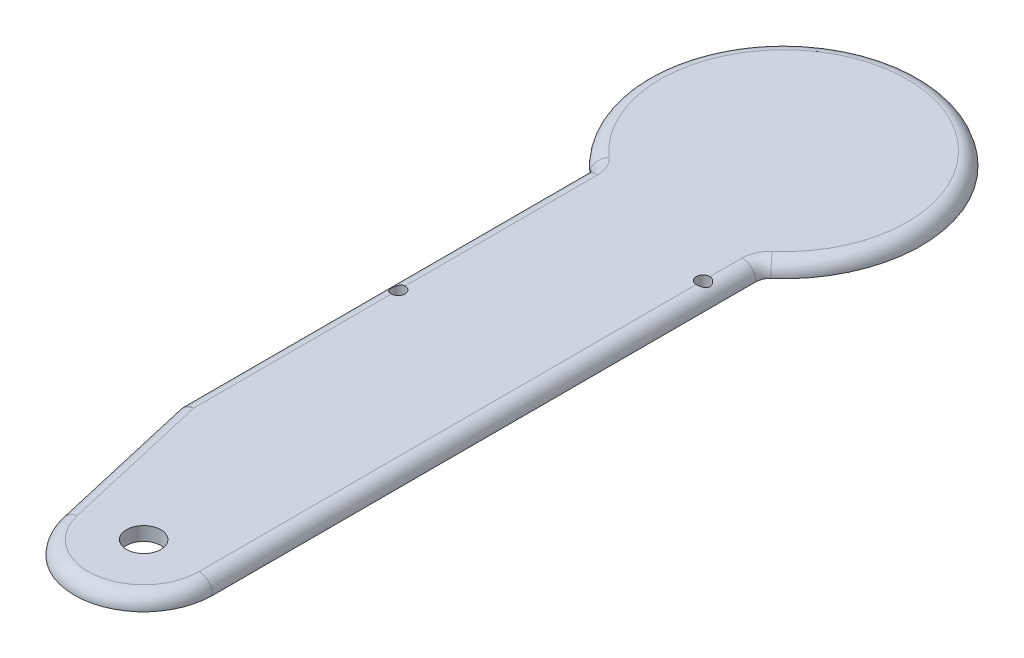
ISO-10303-21;
HEADER;
FILE_DESCRIPTION(('STEP AP214'),'2;1');
FILE_NAME('part.step','',(''),(''),'','','');
FILE_SCHEMA(('AUTOMOTIVE_DESIGN { 1 0 10303 214 1 1 1 1 }'));
ENDSEC;
DATA;
#1=APPLICATION_CONTEXT('core data for automotive mechanical design processes');
#2=APPLICATION_PROTOCOL_DEFINITION('international standard','automotive_design',2000,#1);
#3=PRODUCT_CONTEXT('',#1,'mechanical');
#4=PRODUCT('Part','Part','',(#3));
#5=PRODUCT_RELATED_PRODUCT_CATEGORY('part','',(#4));
#6=PRODUCT_DEFINITION_FORMATION('','',#4);
#7=PRODUCT_DEFINITION_CONTEXT('part definition',#1,'design');
#8=PRODUCT_DEFINITION('design','',#6,#7);
#9=PRODUCT_DEFINITION_SHAPE('','',#8);
#10=(LENGTH_UNIT() NAMED_UNIT(*) SI_UNIT(.MILLI.,.METRE.));
#11=(NAMED_UNIT(*) PLANE_ANGLE_UNIT() SI_UNIT($,.RADIAN.));
#12=(NAMED_UNIT(*) SI_UNIT($,.STERADIAN.) SOLID_ANGLE_UNIT());
#13=UNCERTAINTY_MEASURE_WITH_UNIT(LENGTH_MEASURE(1.E-05),#10,'distance_accuracy_value','');
#14=(GEOMETRIC_REPRESENTATION_CONTEXT(3) GLOBAL_UNCERTAINTY_ASSIGNED_CONTEXT((#13)) GLOBAL_UNIT_ASSIGNED_CONTEXT((#10,
#11,#12)) REPRESENTATION_CONTEXT('',''));
#15=CARTESIAN_POINT('',(0.,0.,0.));
#16=DIRECTION('',(0.,0.,1.));
#17=DIRECTION('',(1.,0.,0.));
#18=AXIS2_PLACEMENT_3D('',#15,#16,#17);
#19=CARTESIAN_POINT('',(0.,2.54,0.));
#20=DIRECTION('',(0.,1.,0.));
#21=DIRECTION('',(0.,0.,1.));
#22=AXIS2_PLACEMENT_3D('',#19,#20,#21);
#23=PLANE('',#22);
#24=CARTESIAN_POINT('',(3.09317439494254,2.54,121.427868644915));
#25=DIRECTION('',(0.,1.,0.));
#26=DIRECTION('',(0.,0.,1.));
#27=AXIS2_PLACEMENT_3D('',#24,#25,#26);
#28=CIRCLE('',#27,3.175);
#29=CARTESIAN_POINT('',(3.09317439494254,2.54,124.602868644915));
#30=VERTEX_POINT('',#29);
#31=EDGE_CURVE('E256',#30,#30,#28,.T.);
#32=ORIENTED_EDGE('',*,*,#31,.F.);
#33=EDGE_LOOP('',(#32));
#34=FACE_BOUND('',#33,.T.);
#35=CARTESIAN_POINT('',(13.335,2.54,28.2505998603972));
#36=DIRECTION('',(0.,1.,0.));
#37=DIRECTION('',(0.,0.,1.));
#38=AXIS2_PLACEMENT_3D('',#35,#36,#37);
#39=CIRCLE('',#38,1.27);
#40=CARTESIAN_POINT('',(13.335,2.54,26.9805998603972));
#41=VERTEX_POINT('',#40);
#42=CARTESIAN_POINT('',(13.335,2.54,29.5205998603972));
#43=VERTEX_POINT('',#42);
#44=EDGE_CURVE('E262',#41,#43,#39,.T.);
#45=ORIENTED_EDGE('',*,*,#44,.F.);
#46=DIRECTION('',(0.,0.,-1.));
#47=VECTOR('',#46,1.);
#48=CARTESIAN_POINT('',(13.335,2.54,21.0126479768734));
#49=LINE('',#48,#47);
#50=CARTESIAN_POINT('',(13.335,2.54,21.0126479768734));
#51=VERTEX_POINT('',#50);
#52=EDGE_CURVE('E66',#41,#51,#49,.T.);
#53=ORIENTED_EDGE('',*,*,#52,.T.);
#54=CARTESIAN_POINT('',(18.415,2.54,21.0126479768734));
#55=DIRECTION('',(0.,1.,0.));
#56=DIRECTION('',(0.,0.,1.));
#57=AXIS2_PLACEMENT_3D('',#54,#55,#56);
#58=CIRCLE('',#57,5.08);
#59=CARTESIAN_POINT('',(15.0668181818182,2.54,17.1921665265327));
#60=VERTEX_POINT('',#59);
#61=EDGE_CURVE('E71',#51,#60,#58,.F.);
#62=ORIENTED_EDGE('',*,*,#61,.T.);
#63=CARTESIAN_POINT('',(0.,2.54,0.));
#64=DIRECTION('',(0.,1.,0.));
#65=DIRECTION('',(0.,0.,1.));
#66=AXIS2_PLACEMENT_3D('',#63,#64,#65);
#67=CIRCLE('',#66,22.86);
#68=CARTESIAN_POINT('',(-15.0668181818182,2.54,17.1921665265328));
#69=VERTEX_POINT('',#68);
#70=EDGE_CURVE('E188',#60,#69,#67,.T.);
#71=ORIENTED_EDGE('',*,*,#70,.T.);
#72=CARTESIAN_POINT('',(-18.415,2.54,21.0126479768734));
#73=DIRECTION('',(0.,1.,0.));
#74=DIRECTION('',(0.,0.,1.));
#75=AXIS2_PLACEMENT_3D('',#72,#73,#74);
#76=CIRCLE('',#75,5.08);
#77=CARTESIAN_POINT('',(-13.335,2.54,21.0126479768734));
#78=VERTEX_POINT('',#77);
#79=EDGE_CURVE('E184',#69,#78,#76,.F.);
#80=ORIENTED_EDGE('',*,*,#79,.T.);
#81=DIRECTION('',(0.,0.,1.));
#82=VECTOR('',#81,1.);
#83=CARTESIAN_POINT('',(-13.335,2.54,95.7390735065831));
#84=LINE('',#83,#82);
#85=CARTESIAN_POINT('',(-13.335,2.54,56.6578686449149));
#86=VERTEX_POINT('',#85);
#87=EDGE_CURVE('E181',#78,#86,#84,.T.);
#88=ORIENTED_EDGE('',*,*,#87,.T.);
#89=CARTESIAN_POINT('',(-13.335,2.54,57.9278686449149));
#90=DIRECTION('',(0.,1.,0.));
#91=DIRECTION('',(0.,0.,1.));
#92=AXIS2_PLACEMENT_3D('',#89,#90,#91);
#93=CIRCLE('',#92,1.27);
#94=CARTESIAN_POINT('',(-13.335,2.54,59.1978686449149));
#95=VERTEX_POINT('',#94);
#96=EDGE_CURVE('E273',#95,#86,#93,.T.);
#97=ORIENTED_EDGE('',*,*,#96,.F.);
#98=DIRECTION('',(0.,0.,1.));
#99=VECTOR('',#98,1.);
#100=CARTESIAN_POINT('',(-13.335,2.54,95.7390735065831));
#101=LINE('',#100,#99);
#102=CARTESIAN_POINT('',(-13.335,2.54,95.7390735065831));
#103=VERTEX_POINT('',#102);
#104=EDGE_CURVE('E170',#95,#103,#101,.T.);
#105=ORIENTED_EDGE('',*,*,#104,.T.);
#106=DIRECTION('',(0.224495594777402,0.,0.974475103799754));
#107=VECTOR('',#106,1.);
#108=CARTESIAN_POINT('',(-6.88722967464479,2.54,123.727113375729));
#109=LINE('',#108,#107);
#110=CARTESIAN_POINT('',(-6.8872296746448,2.54,123.727113375729));
#111=VERTEX_POINT('',#110);
#112=EDGE_CURVE('E173',#103,#111,#109,.T.);
#113=ORIENTED_EDGE('',*,*,#112,.T.);
#114=CARTESIAN_POINT('',(3.09317439494254,2.54,121.427868644915));
#115=DIRECTION('',(0.,1.,0.));
#116=DIRECTION('',(0.,0.,1.));
#117=AXIS2_PLACEMENT_3D('',#114,#115,#116);
#118=CIRCLE('',#117,10.2418256050575);
#119=CARTESIAN_POINT('',(13.335,2.54,121.427868644915));
#120=VERTEX_POINT('',#119);
#121=EDGE_CURVE('E140',#111,#120,#118,.T.);
#122=ORIENTED_EDGE('',*,*,#121,.T.);
#123=DIRECTION('',(0.,0.,-1.));
#124=VECTOR('',#123,1.);
#125=CARTESIAN_POINT('',(13.335,2.54,21.0126479768734));
#126=LINE('',#125,#124);
#127=EDGE_CURVE('E178',#120,#43,#126,.T.);
#128=ORIENTED_EDGE('',*,*,#127,.T.);
#129=EDGE_LOOP('',(#45,#53,#62,#71,#80,#88,#97,#105,#113,#122,#128));
#130=FACE_BOUND('',#129,.T.);
#131=ADVANCED_FACE('F48',(#34,#130),#23,.T.);
#132=CARTESIAN_POINT('',(0.,0.,0.));
#133=DIRECTION('',(0.,1.,0.));
#134=DIRECTION('',(0.,0.,1.));
#135=AXIS2_PLACEMENT_3D('',#132,#133,#134);
#136=PLANE('',#135);
#137=DIRECTION('',(0.224495594777402,0.,0.974475103799754));
#138=VECTOR('',#137,1.);
#139=CARTESIAN_POINT('',(-15.875,0.,96.0278686449149));
#140=LINE('',#139,#138);
#141=CARTESIAN_POINT('',(-15.8101667636514,0.,96.3092923173177));
#142=VERTEX_POINT('',#141);
#143=CARTESIAN_POINT('',(-9.36239643829617,0.,124.297332186463));
#144=VERTEX_POINT('',#143);
#145=EDGE_CURVE('E128',#142,#144,#140,.T.);
#146=ORIENTED_EDGE('',*,*,#145,.F.);
#147=CARTESIAN_POINT('',(-13.335,0.,95.7390735065831));
#148=DIRECTION('',(0.,1.,0.));
#149=DIRECTION('',(0.,0.,1.));
#150=AXIS2_PLACEMENT_3D('',#147,#148,#149);
#151=CIRCLE('',#150,2.54);
#152=CARTESIAN_POINT('',(-15.875,0.,95.7390735065831));
#153=VERTEX_POINT('',#152);
#154=EDGE_CURVE('E160',#142,#153,#151,.F.);
#155=ORIENTED_EDGE('',*,*,#154,.T.);
#156=DIRECTION('',(0.,0.,1.));
#157=VECTOR('',#156,1.);
#158=CARTESIAN_POINT('',(-15.875,0.,19.8278686449149));
#159=LINE('',#158,#157);
#160=CARTESIAN_POINT('',(-15.875,0.,21.0126479768734));
#161=VERTEX_POINT('',#160);
#162=EDGE_CURVE('E150',#161,#153,#159,.T.);
#163=ORIENTED_EDGE('',*,*,#162,.F.);
#164=CARTESIAN_POINT('',(-18.415,0.,21.0126479768734));
#165=DIRECTION('',(0.,1.,0.));
#166=DIRECTION('',(0.,0.,1.));
#167=AXIS2_PLACEMENT_3D('',#164,#165,#166);
#168=CIRCLE('',#167,2.54);
#169=CARTESIAN_POINT('',(-16.7409090909091,0.,19.1024072517031));
#170=VERTEX_POINT('',#169);
#171=EDGE_CURVE('E163',#161,#170,#168,.T.);
#172=ORIENTED_EDGE('',*,*,#171,.T.);
#173=CARTESIAN_POINT('',(0.,0.,0.));
#174=DIRECTION('',(0.,1.,0.));
#175=DIRECTION('',(0.,0.,1.));
#176=AXIS2_PLACEMENT_3D('',#173,#174,#175);
#177=CIRCLE('',#176,25.4);
#178=CARTESIAN_POINT('',(16.7409090909091,0.,19.1024072517031));
#179=VERTEX_POINT('',#178);
#180=EDGE_CURVE('E154',#179,#170,#177,.T.);
#181=ORIENTED_EDGE('',*,*,#180,.F.);
#182=CARTESIAN_POINT('',(18.415,0.,21.0126479768734));
#183=DIRECTION('',(0.,1.,0.));
#184=DIRECTION('',(0.,0.,1.));
#185=AXIS2_PLACEMENT_3D('',#182,#183,#184);
#186=CIRCLE('',#185,2.54);
#187=CARTESIAN_POINT('',(15.875,0.,21.0126479768734));
#188=VERTEX_POINT('',#187);
#189=EDGE_CURVE('E167',#179,#188,#186,.T.);
#190=ORIENTED_EDGE('',*,*,#189,.T.);
#191=DIRECTION('',(0.,0.,-1.));
#192=VECTOR('',#191,1.);
#193=CARTESIAN_POINT('',(15.875,0.,96.0278686449149));
#194=LINE('',#193,#192);
#195=CARTESIAN_POINT('',(15.875,0.,121.427868644915));
#196=VERTEX_POINT('',#195);
#197=EDGE_CURVE('E131',#196,#188,#194,.T.);
#198=ORIENTED_EDGE('',*,*,#197,.F.);
#199=CARTESIAN_POINT('',(3.09317439494254,0.,121.427868644915));
#200=DIRECTION('',(0.,1.,0.));
#201=DIRECTION('',(0.,0.,1.));
#202=AXIS2_PLACEMENT_3D('',#199,#200,#201);
#203=CIRCLE('',#202,12.7818256050575);
#204=EDGE_CURVE('E123',#144,#196,#203,.T.);
#205=ORIENTED_EDGE('',*,*,#204,.F.);
#206=EDGE_LOOP('',(#146,#155,#163,#172,#181,#190,#198,#205));
#207=FACE_BOUND('',#206,.T.);
#208=CARTESIAN_POINT('',(-13.335,0.,57.9278686449149));
#209=DIRECTION('',(0.,1.,0.));
#210=DIRECTION('',(0.,0.,1.));
#211=AXIS2_PLACEMENT_3D('',#208,#209,#210);
#212=CIRCLE('',#211,1.27);
#213=CARTESIAN_POINT('',(-13.335,0.,59.1978686449149));
#214=VERTEX_POINT('',#213);
#215=EDGE_CURVE('E266',#214,#214,#212,.T.);
#216=ORIENTED_EDGE('',*,*,#215,.T.);
#217=EDGE_LOOP('',(#216));
#218=FACE_BOUND('',#217,.T.);
#219=CARTESIAN_POINT('',(3.09317439494254,0.,121.427868644915));
#220=DIRECTION('',(0.,1.,0.));
#221=DIRECTION('',(0.,0.,1.));
#222=AXIS2_PLACEMENT_3D('',#219,#220,#221);
#223=CIRCLE('',#222,3.175);
#224=CARTESIAN_POINT('',(3.09317439494254,0.,124.602868644915));
#225=VERTEX_POINT('',#224);
#226=EDGE_CURVE('E259',#225,#225,#223,.T.);
#227=ORIENTED_EDGE('',*,*,#226,.T.);
#228=EDGE_LOOP('',(#227));
#229=FACE_BOUND('',#228,.T.);
#230=CARTESIAN_POINT('',(13.335,0.,28.2505998603972));
#231=DIRECTION('',(0.,1.,0.));
#232=DIRECTION('',(0.,0.,1.));
#233=AXIS2_PLACEMENT_3D('',#230,#231,#232);
#234=CIRCLE('',#233,1.27);
#235=CARTESIAN_POINT('',(13.335,0.,29.5205998603972));
#236=VERTEX_POINT('',#235);
#237=EDGE_CURVE('E269',#236,#236,#234,.T.);
#238=ORIENTED_EDGE('',*,*,#237,.T.);
#239=EDGE_LOOP('',(#238));
#240=FACE_BOUND('',#239,.T.);
#241=ADVANCED_FACE('F125',(#207,#218,#229,#240),#136,.F.);
#242=CARTESIAN_POINT('',(-13.335,2.54,57.9278686449149));
#243=DIRECTION('',(0.,-1.,0.));
#244=DIRECTION('',(0.,0.,-1.));
#245=AXIS2_PLACEMENT_3D('',#242,#243,#244);
#246=CYLINDRICAL_SURFACE('',#245,1.27);
#247=ORIENTED_EDGE('',*,*,#96,.T.);
#248=CARTESIAN_POINT('',(-13.335,2.54,56.6578686449149));
#249=CARTESIAN_POINT('',(-13.3685345942167,2.54000342832328,56.6578668634472));
#250=CARTESIAN_POINT('',(-13.4020513618429,2.53933515140333,56.659197786609));
#251=CARTESIAN_POINT('',(-13.468811013313,2.53669226267304,56.6644940244821));
#252=CARTESIAN_POINT('',(-13.5020540017188,2.5347181754675,56.6684582812633));
#253=CARTESIAN_POINT('',(-13.6007001890822,2.5269200467094,56.6841994487184));
#254=CARTESIAN_POINT('',(-13.6653865691835,2.51921930895587,56.6998255446011));
#255=CARTESIAN_POINT('',(-13.7908255180717,2.49957243089578,56.7406538840443));
#256=CARTESIAN_POINT('',(-13.8515824932679,2.48763114703347,56.7658451754331));
#257=CARTESIAN_POINT('',(-13.9679961690622,2.46058761540837,56.8249265719279));
#258=CARTESIAN_POINT('',(-14.0236476966289,2.44548221141404,56.8588253705301));
#259=CARTESIAN_POINT('',(-14.1319389724485,2.41244361519352,56.9366576743732));
#260=CARTESIAN_POINT('',(-14.1841978627295,2.39439515549001,56.9810711066731));
#261=CARTESIAN_POINT('',(-14.2808742053925,2.35787969829176,57.0776363350059));
#262=CARTESIAN_POINT('',(-14.3252865037335,2.33941243462373,57.1297931762225));
#263=CARTESIAN_POINT('',(-14.4084706424894,2.30249645476485,57.2452232115186));
#264=CARTESIAN_POINT('',(-14.4465371088236,2.28416043722765,57.3090450150755));
#265=CARTESIAN_POINT('',(-14.5112342622057,2.25153158727119,57.443196842687));
#266=CARTESIAN_POINT('',(-14.5378733891325,2.23723577355424,57.5135220167264));
#267=CARTESIAN_POINT('',(-14.57722799061,2.21561503041513,57.6543925518967));
#268=CARTESIAN_POINT('',(-14.5906815353958,2.20792402232111,57.7246726984248));
#269=CARTESIAN_POINT('',(-14.6055422458466,2.19941002335184,57.8668801313889));
#270=CARTESIAN_POINT('',(-14.6069610435321,2.1985804007175,57.9388057599526));
#271=CARTESIAN_POINT('',(-14.5982528116857,2.20358883939752,58.0730125775866));
#272=CARTESIAN_POINT('',(-14.589486202326,2.20864140862576,58.1354185179297));
#273=CARTESIAN_POINT('',(-14.5630132221279,2.2234683165053,58.2577167700999));
#274=CARTESIAN_POINT('',(-14.5453041968256,2.23324405714403,58.3176083298381));
#275=CARTESIAN_POINT('',(-14.5011267389414,2.256630786266,58.434888821377));
#276=CARTESIAN_POINT('',(-14.4744639065128,2.27032579467092,58.4921869809792));
#277=CARTESIAN_POINT('',(-14.4132838643138,2.30001279493636,58.6017727560536));
#278=CARTESIAN_POINT('',(-14.3787629105045,2.3160058803827,58.6540579661513));
#279=CARTESIAN_POINT('',(-14.2977453521224,2.3509365238757,58.7591088988116));
#280=CARTESIAN_POINT('',(-14.2502854429472,2.3699903595553,58.8110955769709));
#281=CARTESIAN_POINT('',(-14.1472384712374,2.40725373504748,58.906700016829));
#282=CARTESIAN_POINT('',(-14.0916470490276,2.42546281500637,58.9503132599566));
#283=CARTESIAN_POINT('',(-13.9706267780721,2.46002401214475,59.0298496904732));
#284=CARTESIAN_POINT('',(-13.9048586712854,2.4762488597521,59.0653158685882));
#285=CARTESIAN_POINT('',(-13.7673106117041,2.50391748349066,59.1243573234846));
#286=CARTESIAN_POINT('',(-13.6955417405689,2.51536984868801,59.147953977915));
#287=CARTESIAN_POINT('',(-13.5751590407403,2.5290606333048,59.1758816110379));
#288=CARTESIAN_POINT('',(-13.5276232427572,2.53313545728544,59.1840986450059));
#289=CARTESIAN_POINT('',(-13.4317390252086,2.53861665841248,59.1951024340299));
#290=CARTESIAN_POINT('',(-13.3833899777024,2.54002086815003,59.1978847784668));
#291=CARTESIAN_POINT('',(-13.335,2.54,59.1978686449149));
#292=B_SPLINE_CURVE_WITH_KNOTS('',3,(#248,#249,#250,#251,#252,#253,#254,#255,#256,#257,#258,
#259,#260,#261,#262,#263,#264,#265,#266,#267,#268,#269,#270,#271,#272,#273,#274,#275,#276,#277,
#278,#279,#280,#281,#282,#283,#284,#285,#286,#287,#288,#289,#290,#291),.UNSPECIFIED.,.F.,.F.,(4,
2,2,2,2,2,2,2,2,2,2,2,2,2,2,2,2,2,2,2,2,4),(0.,0.100536257078659,0.201032148572755,
0.400941212724322,0.600622067407709,0.800503061810346,1.01237290775346,1.22438140734053,
1.45284573032248,1.68114102489041,1.89576940943866,2.11019032418494,2.29896967474706,
2.48780509548095,2.68103847063103,2.87436410615118,3.09219313103621,3.31013937500783,
3.53831494714631,3.76607807807347,3.91095596271824,4.05595137681726),.UNSPECIFIED.);
#293=EDGE_CURVE('E11',#86,#95,#292,.T.);
#294=ORIENTED_EDGE('',*,*,#293,.T.);
#295=EDGE_LOOP('',(#247,#294));
#296=FACE_BOUND('',#295,.T.);
#297=ORIENTED_EDGE('',*,*,#215,.F.);
#298=EDGE_LOOP('',(#297));
#299=FACE_BOUND('',#298,.T.);
#300=ADVANCED_FACE('F240',(#296,#299),#246,.F.);
#301=CARTESIAN_POINT('',(3.09317439494254,2.54,121.427868644915));
#302=DIRECTION('',(0.,-1.,0.));
#303=DIRECTION('',(0.,0.,-1.));
#304=AXIS2_PLACEMENT_3D('',#301,#302,#303);
#305=CYLINDRICAL_SURFACE('',#304,3.175);
#306=ORIENTED_EDGE('',*,*,#31,.T.);
#307=EDGE_LOOP('',(#306));
#308=FACE_BOUND('',#307,.T.);
#309=ORIENTED_EDGE('',*,*,#226,.F.);
#310=EDGE_LOOP('',(#309));
#311=FACE_BOUND('',#310,.T.);
#312=ADVANCED_FACE('F245',(#308,#311),#305,.F.);
#313=CARTESIAN_POINT('',(13.335,2.54,28.2505998603972));
#314=DIRECTION('',(0.,-1.,0.));
#315=DIRECTION('',(0.,0.,-1.));
#316=AXIS2_PLACEMENT_3D('',#313,#314,#315);
#317=CYLINDRICAL_SURFACE('',#316,1.27);
#318=ORIENTED_EDGE('',*,*,#44,.T.);
#319=CARTESIAN_POINT('',(13.335,2.54,29.5205998603972));
#320=CARTESIAN_POINT('',(13.3685345942167,2.54000342832328,29.520601641865));
#321=CARTESIAN_POINT('',(13.4020513618429,2.53933515140333,29.5192707187032));
#322=CARTESIAN_POINT('',(13.468811013313,2.53669226267304,29.5139744808301));
#323=CARTESIAN_POINT('',(13.5020540017188,2.5347181754675,29.5100102240488));
#324=CARTESIAN_POINT('',(13.6007001890822,2.5269200467094,29.4942690565938));
#325=CARTESIAN_POINT('',(13.6653865691835,2.51921930895587,29.4786429607111));
#326=CARTESIAN_POINT('',(13.7908255180717,2.49957243089578,29.4378146212678));
#327=CARTESIAN_POINT('',(13.8515824932679,2.48763114703347,29.412623329879));
#328=CARTESIAN_POINT('',(13.9679961690622,2.46058761540837,29.3535419333843));
#329=CARTESIAN_POINT('',(14.0236476966289,2.44548221141404,29.319643134782));
#330=CARTESIAN_POINT('',(14.1319389724485,2.41244361519351,29.241810830939));
#331=CARTESIAN_POINT('',(14.1841978627295,2.39439515549001,29.1973973986391));
#332=CARTESIAN_POINT('',(14.2808742053925,2.35787969829176,29.1008321703063));
#333=CARTESIAN_POINT('',(14.3252865037335,2.33941243462373,29.0486753290896));
#334=CARTESIAN_POINT('',(14.4084706424894,2.30249645476485,28.9332452937936));
#335=CARTESIAN_POINT('',(14.4465371088237,2.28416043722765,28.8694234902367));
#336=CARTESIAN_POINT('',(14.5112342622057,2.25153158727119,28.7352716626252));
#337=CARTESIAN_POINT('',(14.5378733891325,2.23723577355424,28.6649464885858));
#338=CARTESIAN_POINT('',(14.57722799061,2.21561503041512,28.5240759534155));
#339=CARTESIAN_POINT('',(14.5906815353958,2.2079240223211,28.4537958068874));
#340=CARTESIAN_POINT('',(14.6055422458466,2.19941002335184,28.3115883739233));
#341=CARTESIAN_POINT('',(14.6069610435321,2.1985804007175,28.2396627453596));
#342=CARTESIAN_POINT('',(14.5982528116857,2.20358883939751,28.1054559277256));
#343=CARTESIAN_POINT('',(14.589486202326,2.20864140862576,28.0430499873825));
#344=CARTESIAN_POINT('',(14.5630132221279,2.2234683165053,27.9207517352122));
#345=CARTESIAN_POINT('',(14.5453041968256,2.23324405714403,27.8608601754741));
#346=CARTESIAN_POINT('',(14.5011267389414,2.256630786266,27.7435796839352));
#347=CARTESIAN_POINT('',(14.4744639065128,2.27032579467091,27.686281524333));
#348=CARTESIAN_POINT('',(14.4132838643138,2.30001279493636,27.5766957492585));
#349=CARTESIAN_POINT('',(14.3787629105045,2.31600588038269,27.5244105391609));
#350=CARTESIAN_POINT('',(14.2977453521224,2.3509365238757,27.4193596065005));
#351=CARTESIAN_POINT('',(14.2502854429472,2.3699903595553,27.3673729283413));
#352=CARTESIAN_POINT('',(14.1472384712374,2.40725373504747,27.2717684884831));
#353=CARTESIAN_POINT('',(14.0916470490276,2.42546281500638,27.2281552453556));
#354=CARTESIAN_POINT('',(13.9706267780721,2.46002401214476,27.1486188148389));
#355=CARTESIAN_POINT('',(13.9048586712854,2.47624885975211,27.113152636724));
#356=CARTESIAN_POINT('',(13.7673106117041,2.50391748349066,27.0541111818275));
#357=CARTESIAN_POINT('',(13.6955417405689,2.51536984868801,27.0305145273972));
#358=CARTESIAN_POINT('',(13.5751590407403,2.5290606333048,27.0025868942743));
#359=CARTESIAN_POINT('',(13.5276232427572,2.53313545728544,26.9943698603063));
#360=CARTESIAN_POINT('',(13.4317390252086,2.53861665841248,26.9833660712823));
#361=CARTESIAN_POINT('',(13.3833899777024,2.54002086815003,26.9805837268453));
#362=CARTESIAN_POINT('',(13.335,2.54,26.9805998603972));
#363=B_SPLINE_CURVE_WITH_KNOTS('',3,(#319,#320,#321,#322,#323,#324,#325,#326,#327,#328,#329,
#330,#331,#332,#333,#334,#335,#336,#337,#338,#339,#340,#341,#342,#343,#344,#345,#346,#347,#348,
#349,#350,#351,#352,#353,#354,#355,#356,#357,#358,#359,#360,#361,#362),.UNSPECIFIED.,.F.,.F.,(4,
2,2,2,2,2,2,2,2,2,2,2,2,2,2,2,2,2,2,2,2,4),(0.,0.10053625707866,0.201032148572757,
0.400941212724324,0.600622067407714,0.800503061810349,1.01237290775346,1.22438140734053,
1.45284573032248,1.68114102489041,1.89576940943866,2.11019032418495,2.29896967474707,
2.48780509548096,2.68103847063104,2.87436410615118,3.09219313103622,3.31013937500784,
3.53831494714633,3.76607807807348,3.91095596271825,4.05595137681726),.UNSPECIFIED.);
#364=EDGE_CURVE('E58',#43,#41,#363,.T.);
#365=ORIENTED_EDGE('',*,*,#364,.T.);
#366=EDGE_LOOP('',(#318,#365));
#367=FACE_BOUND('',#366,.T.);
#368=ORIENTED_EDGE('',*,*,#237,.F.);
#369=EDGE_LOOP('',(#368));
#370=FACE_BOUND('',#369,.T.);
#371=ADVANCED_FACE('F208',(#367,#370),#317,.F.);
#372=CARTESIAN_POINT('',(3.09317439494254,0.,121.427868644915));
#373=DIRECTION('',(0.,1.,0.));
#374=DIRECTION('',(0.,0.,1.));
#375=AXIS2_PLACEMENT_3D('',#372,#373,#374);
#376=TOROIDAL_SURFACE('',#375,10.2418256050575,2.54);
#377=CARTESIAN_POINT('',(-6.8872296746448,0.,123.727113375729));
#378=DIRECTION('',(-0.224495594777402,0.,-0.974475103799753));
#379=DIRECTION('',(-0.974475103799754,0.,0.224495594777402));
#380=AXIS2_PLACEMENT_3D('',#377,#378,#379);
#381=CIRCLE('',#380,2.54);
#382=EDGE_CURVE('E139',#144,#111,#381,.T.);
#383=ORIENTED_EDGE('',*,*,#382,.F.);
#384=ORIENTED_EDGE('',*,*,#204,.T.);
#385=CARTESIAN_POINT('',(13.335,0.,121.427868644915));
#386=DIRECTION('',(0.,0.,-1.));
#387=DIRECTION('',(-1.,0.,0.));
#388=AXIS2_PLACEMENT_3D('',#385,#386,#387);
#389=CIRCLE('',#388,2.54);
#390=EDGE_CURVE('E52',#120,#196,#389,.T.);
#391=ORIENTED_EDGE('',*,*,#390,.F.);
#392=ORIENTED_EDGE('',*,*,#121,.F.);
#393=EDGE_LOOP('',(#383,#384,#391,#392));
#394=FACE_BOUND('',#393,.T.);
#395=ADVANCED_FACE('F50',(#394),#376,.T.);
#396=CARTESIAN_POINT('',(13.335,0.,0.));
#397=DIRECTION('',(0.,0.,1.));
#398=DIRECTION('',(1.,0.,0.));
#399=AXIS2_PLACEMENT_3D('',#396,#397,#398);
#400=CYLINDRICAL_SURFACE('',#399,2.54);
#401=ORIENTED_EDGE('',*,*,#390,.T.);
#402=ORIENTED_EDGE('',*,*,#197,.T.);
#403=CARTESIAN_POINT('',(13.335,0.,21.0126479768734));
#404=DIRECTION('',(0.,0.,-1.));
#405=DIRECTION('',(-1.,0.,0.));
#406=AXIS2_PLACEMENT_3D('',#403,#404,#405);
#407=CIRCLE('',#406,2.54);
#408=EDGE_CURVE('E144',#51,#188,#407,.T.);
#409=ORIENTED_EDGE('',*,*,#408,.F.);
#410=ORIENTED_EDGE('',*,*,#52,.F.);
#411=ORIENTED_EDGE('',*,*,#364,.F.);
#412=ORIENTED_EDGE('',*,*,#127,.F.);
#413=EDGE_LOOP('',(#401,#402,#409,#410,#411,#412));
#414=FACE_BOUND('',#413,.T.);
#415=ADVANCED_FACE('F211',(#414),#400,.T.);
#416=CARTESIAN_POINT('',(-33.6073326917641,0.,7.74232005733209));
#417=DIRECTION('',(-0.224495594777402,0.,-0.974475103799754));
#418=DIRECTION('',(-0.974475103799754,0.,0.224495594777402));
#419=AXIS2_PLACEMENT_3D('',#416,#417,#418);
#420=CYLINDRICAL_SURFACE('',#419,2.54);
#421=ORIENTED_EDGE('',*,*,#382,.T.);
#422=ORIENTED_EDGE('',*,*,#112,.F.);
#423=CARTESIAN_POINT('',(-13.335,0.,95.7390735065831));
#424=DIRECTION('',(-0.224495594777402,0.,-0.974475103799753));
#425=DIRECTION('',(-0.974475103799754,0.,0.224495594777402));
#426=AXIS2_PLACEMENT_3D('',#423,#424,#425);
#427=CIRCLE('',#426,2.54);
#428=EDGE_CURVE('E147',#142,#103,#427,.T.);
#429=ORIENTED_EDGE('',*,*,#428,.F.);
#430=ORIENTED_EDGE('',*,*,#145,.T.);
#431=EDGE_LOOP('',(#421,#422,#429,#430));
#432=FACE_BOUND('',#431,.T.);
#433=ADVANCED_FACE('F145',(#432),#420,.T.);
#434=CARTESIAN_POINT('',(18.415,0.,21.0126479768734));
#435=DIRECTION('',(0.,1.,0.));
#436=DIRECTION('',(0.,0.,1.));
#437=AXIS2_PLACEMENT_3D('',#434,#435,#436);
#438=TOROIDAL_SURFACE('',#437,5.08,2.54);
#439=ORIENTED_EDGE('',*,*,#408,.T.);
#440=ORIENTED_EDGE('',*,*,#189,.F.);
#441=CARTESIAN_POINT('',(15.0668181818182,0.,17.1921665265327));
#442=DIRECTION('',(0.752063277626104,0.,-0.659090909090909));
#443=DIRECTION('',(-0.659090909090909,0.,-0.752063277626105));
#444=AXIS2_PLACEMENT_3D('',#441,#442,#443);
#445=CIRCLE('',#444,2.54);
#446=EDGE_CURVE('E286',#60,#179,#445,.T.);
#447=ORIENTED_EDGE('',*,*,#446,.F.);
#448=ORIENTED_EDGE('',*,*,#61,.F.);
#449=EDGE_LOOP('',(#439,#440,#447,#448));
#450=FACE_BOUND('',#449,.T.);
#451=ADVANCED_FACE('F218',(#450),#438,.T.);
#452=CARTESIAN_POINT('',(-13.335,0.,95.7390735065831));
#453=DIRECTION('',(0.,1.,0.));
#454=DIRECTION('',(0.,0.,1.));
#455=AXIS2_PLACEMENT_3D('',#452,#453,#454);
#456=SPHERICAL_SURFACE('',#455,2.54);
#457=ORIENTED_EDGE('',*,*,#154,.F.);
#458=ORIENTED_EDGE('',*,*,#428,.T.);
#459=CARTESIAN_POINT('',(-13.335,0.,95.7390735065831));
#460=DIRECTION('',(0.,0.,-1.));
#461=DIRECTION('',(-1.,0.,0.));
#462=AXIS2_PLACEMENT_3D('',#459,#460,#461);
#463=CIRCLE('',#462,2.54);
#464=EDGE_CURVE('E296',#153,#103,#463,.T.);
#465=ORIENTED_EDGE('',*,*,#464,.F.);
#466=EDGE_LOOP('',(#457,#458,#465));
#467=FACE_BOUND('',#466,.T.);
#468=ADVANCED_FACE('F221',(#467),#456,.T.);
#469=CARTESIAN_POINT('',(0.,0.,0.));
#470=DIRECTION('',(0.,1.,0.));
#471=DIRECTION('',(0.,0.,1.));
#472=AXIS2_PLACEMENT_3D('',#469,#470,#471);
#473=TOROIDAL_SURFACE('',#472,22.86,2.54);
#474=ORIENTED_EDGE('',*,*,#446,.T.);
#475=ORIENTED_EDGE('',*,*,#180,.T.);
#476=CARTESIAN_POINT('',(-15.0668181818182,0.,17.1921665265328));
#477=DIRECTION('',(0.752063277626103,0.,0.659090909090911));
#478=DIRECTION('',(0.659090909090911,0.,-0.752063277626103));
#479=AXIS2_PLACEMENT_3D('',#476,#477,#478);
#480=CIRCLE('',#479,2.54);
#481=EDGE_CURVE('E284',#69,#170,#480,.T.);
#482=ORIENTED_EDGE('',*,*,#481,.F.);
#483=ORIENTED_EDGE('',*,*,#70,.F.);
#484=EDGE_LOOP('',(#474,#475,#482,#483));
#485=FACE_BOUND('',#484,.T.);
#486=ADVANCED_FACE('F225',(#485),#473,.T.);
#487=CARTESIAN_POINT('',(-13.335,0.,0.));
#488=DIRECTION('',(0.,0.,-1.));
#489=DIRECTION('',(-1.,0.,0.));
#490=AXIS2_PLACEMENT_3D('',#487,#488,#489);
#491=CYLINDRICAL_SURFACE('',#490,2.54);
#492=ORIENTED_EDGE('',*,*,#293,.F.);
#493=ORIENTED_EDGE('',*,*,#87,.F.);
#494=CARTESIAN_POINT('',(-13.335,0.,21.0126479768734));
#495=DIRECTION('',(0.,0.,-1.));
#496=DIRECTION('',(-1.,0.,0.));
#497=AXIS2_PLACEMENT_3D('',#494,#495,#496);
#498=CIRCLE('',#497,2.54);
#499=EDGE_CURVE('E290',#161,#78,#498,.T.);
#500=ORIENTED_EDGE('',*,*,#499,.F.);
#501=ORIENTED_EDGE('',*,*,#162,.T.);
#502=ORIENTED_EDGE('',*,*,#464,.T.);
#503=ORIENTED_EDGE('',*,*,#104,.F.);
#504=EDGE_LOOP('',(#492,#493,#500,#501,#502,#503));
#505=FACE_BOUND('',#504,.T.);
#506=ADVANCED_FACE('F228',(#505),#491,.T.);
#507=CARTESIAN_POINT('',(-18.415,0.,21.0126479768734));
#508=DIRECTION('',(0.,1.,0.));
#509=DIRECTION('',(0.,0.,1.));
#510=AXIS2_PLACEMENT_3D('',#507,#508,#509);
#511=TOROIDAL_SURFACE('',#510,5.08,2.54);
#512=ORIENTED_EDGE('',*,*,#481,.T.);
#513=ORIENTED_EDGE('',*,*,#171,.F.);
#514=ORIENTED_EDGE('',*,*,#499,.T.);
#515=ORIENTED_EDGE('',*,*,#79,.F.);
#516=EDGE_LOOP('',(#512,#513,#514,#515));
#517=FACE_BOUND('',#516,.T.);
#518=ADVANCED_FACE('F233',(#517),#511,.T.);
#519=CLOSED_SHELL('',(#131,#241,#300,#312,#371,#395,#415,#433,#451,#468,#486,#506,#518));
#520=MANIFOLD_SOLID_BREP('B2',#519);
#521=ADVANCED_BREP_SHAPE_REPRESENTATION('',(#18,#520),#14);
#522=SHAPE_DEFINITION_REPRESENTATION(#9,#521);
ENDSEC;
END-ISO-10303-21;
